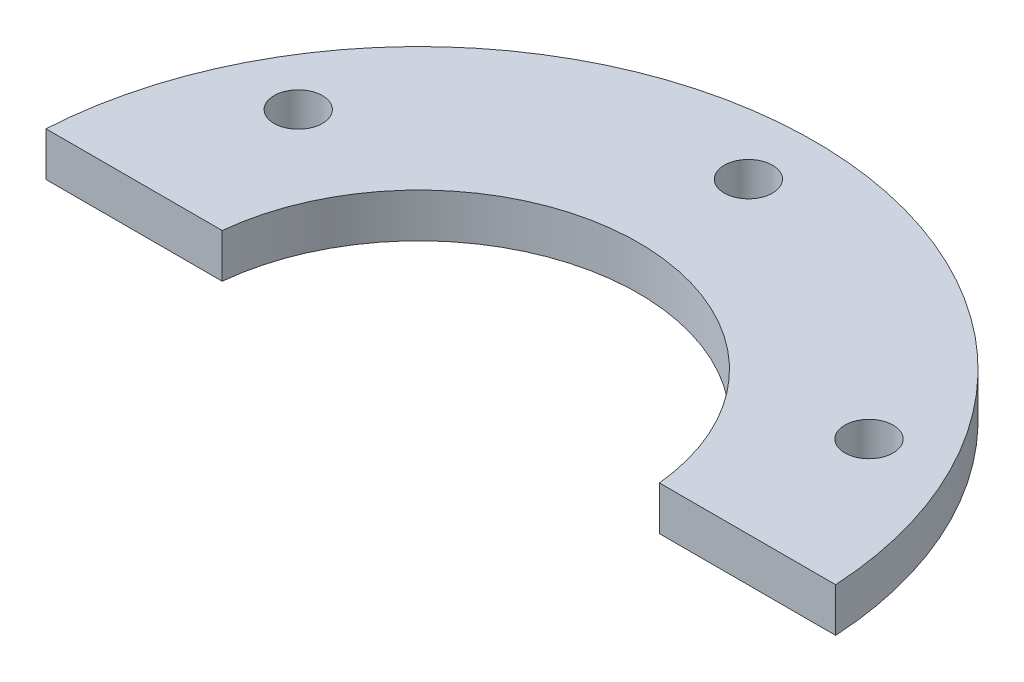
ISO-10303-21;
HEADER;
FILE_DESCRIPTION(('STEP AP214'),'2;1');
FILE_NAME('part.step','',(''),(''),'','','');
FILE_SCHEMA(('AUTOMOTIVE_DESIGN { 1 0 10303 214 1 1 1 1 }'));
ENDSEC;
DATA;
#1=APPLICATION_CONTEXT('core data for automotive mechanical design processes');
#2=APPLICATION_PROTOCOL_DEFINITION('international standard','automotive_design',2000,#1);
#3=PRODUCT_CONTEXT('',#1,'mechanical');
#4=PRODUCT('Part','Part','',(#3));
#5=PRODUCT_RELATED_PRODUCT_CATEGORY('part','',(#4));
#6=PRODUCT_DEFINITION_FORMATION('','',#4);
#7=PRODUCT_DEFINITION_CONTEXT('part definition',#1,'design');
#8=PRODUCT_DEFINITION('design','',#6,#7);
#9=PRODUCT_DEFINITION_SHAPE('','',#8);
#10=(LENGTH_UNIT() NAMED_UNIT(*) SI_UNIT(.MILLI.,.METRE.));
#11=(NAMED_UNIT(*) PLANE_ANGLE_UNIT() SI_UNIT($,.RADIAN.));
#12=(NAMED_UNIT(*) SI_UNIT($,.STERADIAN.) SOLID_ANGLE_UNIT());
#13=UNCERTAINTY_MEASURE_WITH_UNIT(LENGTH_MEASURE(1.E-05),#10,'distance_accuracy_value','');
#14=(GEOMETRIC_REPRESENTATION_CONTEXT(3) GLOBAL_UNCERTAINTY_ASSIGNED_CONTEXT((#13)) GLOBAL_UNIT_ASSIGNED_CONTEXT((#10,
#11,#12)) REPRESENTATION_CONTEXT('',''));
#15=CARTESIAN_POINT('',(0.,0.,0.));
#16=DIRECTION('',(0.,0.,1.));
#17=DIRECTION('',(1.,0.,0.));
#18=AXIS2_PLACEMENT_3D('',#15,#16,#17);
#19=CARTESIAN_POINT('',(0.,10.,0.));
#20=DIRECTION('',(0.,1.,0.));
#21=DIRECTION('',(0.,0.,1.));
#22=AXIS2_PLACEMENT_3D('',#19,#20,#21);
#23=PLANE('',#22);
#24=CARTESIAN_POINT('',(0.,10.,0.));
#25=DIRECTION('',(0.,-1.,0.));
#26=DIRECTION('',(0.,0.,-1.));
#27=AXIS2_PLACEMENT_3D('',#24,#25,#26);
#28=CIRCLE('',#27,90.);
#29=CARTESIAN_POINT('',(-89.8610037780571,10.,-5.));
#30=VERTEX_POINT('',#29);
#31=CARTESIAN_POINT('',(89.8610037780571,10.,-4.99999999999999));
#32=VERTEX_POINT('',#31);
#33=EDGE_CURVE('E55',#30,#32,#28,.T.);
#34=ORIENTED_EDGE('',*,*,#33,.F.);
#35=DIRECTION('',(-1.,0.,0.));
#36=VECTOR('',#35,1.);
#37=CARTESIAN_POINT('',(-89.8610037780571,10.,-5.));
#38=LINE('',#37,#36);
#39=CARTESIAN_POINT('',(-49.749371855331,10.,-4.99999999999999));
#40=VERTEX_POINT('',#39);
#41=EDGE_CURVE('E66',#30,#40,#38,.F.);
#42=ORIENTED_EDGE('',*,*,#41,.T.);
#43=CARTESIAN_POINT('',(0.,10.,0.));
#44=DIRECTION('',(0.,-1.,0.));
#45=DIRECTION('',(0.,0.,-1.));
#46=AXIS2_PLACEMENT_3D('',#43,#44,#45);
#47=CIRCLE('',#46,50.);
#48=CARTESIAN_POINT('',(49.749371855331,10.,-5.));
#49=VERTEX_POINT('',#48);
#50=EDGE_CURVE('E60',#40,#49,#47,.T.);
#51=ORIENTED_EDGE('',*,*,#50,.T.);
#52=DIRECTION('',(-1.,0.,0.));
#53=VECTOR('',#52,1.);
#54=CARTESIAN_POINT('',(49.749371855331,10.,-5.));
#55=LINE('',#54,#53);
#56=EDGE_CURVE('E63',#49,#32,#55,.F.);
#57=ORIENTED_EDGE('',*,*,#56,.T.);
#58=EDGE_LOOP('',(#34,#42,#51,#57));
#59=FACE_BOUND('',#58,.T.);
#60=CARTESIAN_POINT('',(-64.9519052838325,10.,-37.5000000000008));
#61=DIRECTION('',(0.,1.,0.));
#62=DIRECTION('',(0.,0.,1.));
#63=AXIS2_PLACEMENT_3D('',#60,#61,#62);
#64=CIRCLE('',#63,5.49999999999999);
#65=CARTESIAN_POINT('',(-64.9519052838325,10.,-32.0000000000008));
#66=VERTEX_POINT('',#65);
#67=EDGE_CURVE('E80',#66,#66,#64,.F.);
#68=ORIENTED_EDGE('',*,*,#67,.T.);
#69=EDGE_LOOP('',(#68));
#70=FACE_BOUND('',#69,.T.);
#71=CARTESIAN_POINT('',(64.951905283833,10.,-37.4999999999999));
#72=DIRECTION('',(0.,1.,0.));
#73=DIRECTION('',(0.,0.,1.));
#74=AXIS2_PLACEMENT_3D('',#71,#72,#73);
#75=CIRCLE('',#74,5.49999999999999);
#76=CARTESIAN_POINT('',(64.951905283833,10.,-31.9999999999999));
#77=VERTEX_POINT('',#76);
#78=EDGE_CURVE('E70',#77,#77,#75,.F.);
#79=ORIENTED_EDGE('',*,*,#78,.T.);
#80=EDGE_LOOP('',(#79));
#81=FACE_BOUND('',#80,.T.);
#82=CARTESIAN_POINT('',(0.,10.,-75.));
#83=DIRECTION('',(0.,1.,0.));
#84=DIRECTION('',(0.,0.,1.));
#85=AXIS2_PLACEMENT_3D('',#82,#83,#84);
#86=CIRCLE('',#85,5.49999999999999);
#87=CARTESIAN_POINT('',(0.,10.,-69.5));
#88=VERTEX_POINT('',#87);
#89=EDGE_CURVE('E20',#88,#88,#86,.F.);
#90=ORIENTED_EDGE('',*,*,#89,.T.);
#91=EDGE_LOOP('',(#90));
#92=FACE_BOUND('',#91,.T.);
#93=ADVANCED_FACE('F17',(#59,#70,#81,#92),#23,.T.);
#94=CARTESIAN_POINT('',(0.,10.,-75.));
#95=DIRECTION('',(0.,1.,0.));
#96=DIRECTION('',(0.,0.,1.));
#97=AXIS2_PLACEMENT_3D('',#94,#95,#96);
#98=CYLINDRICAL_SURFACE('',#97,5.49999999999999);
#99=ORIENTED_EDGE('',*,*,#89,.F.);
#100=EDGE_LOOP('',(#99));
#101=FACE_BOUND('',#100,.T.);
#102=CARTESIAN_POINT('',(0.,0.,-75.));
#103=DIRECTION('',(0.,1.,0.));
#104=DIRECTION('',(0.,0.,1.));
#105=AXIS2_PLACEMENT_3D('',#102,#103,#104);
#106=CIRCLE('',#105,5.49999999999999);
#107=CARTESIAN_POINT('',(0.,0.,-69.5));
#108=VERTEX_POINT('',#107);
#109=EDGE_CURVE('E95',#108,#108,#106,.F.);
#110=ORIENTED_EDGE('',*,*,#109,.T.);
#111=EDGE_LOOP('',(#110));
#112=FACE_BOUND('',#111,.T.);
#113=ADVANCED_FACE('F137',(#101,#112),#98,.F.);
#114=CARTESIAN_POINT('',(-64.9519052838325,10.,-37.5000000000008));
#115=DIRECTION('',(0.,1.,0.));
#116=DIRECTION('',(0.,0.,1.));
#117=AXIS2_PLACEMENT_3D('',#114,#115,#116);
#118=CYLINDRICAL_SURFACE('',#117,5.49999999999999);
#119=ORIENTED_EDGE('',*,*,#67,.F.);
#120=EDGE_LOOP('',(#119));
#121=FACE_BOUND('',#120,.T.);
#122=CARTESIAN_POINT('',(-64.9519052838325,0.,-37.5000000000008));
#123=DIRECTION('',(0.,1.,0.));
#124=DIRECTION('',(0.,0.,1.));
#125=AXIS2_PLACEMENT_3D('',#122,#123,#124);
#126=CIRCLE('',#125,5.49999999999999);
#127=CARTESIAN_POINT('',(-64.9519052838325,0.,-32.0000000000008));
#128=VERTEX_POINT('',#127);
#129=EDGE_CURVE('E92',#128,#128,#126,.F.);
#130=ORIENTED_EDGE('',*,*,#129,.T.);
#131=EDGE_LOOP('',(#130));
#132=FACE_BOUND('',#131,.T.);
#133=ADVANCED_FACE('F143',(#121,#132),#118,.F.);
#134=CARTESIAN_POINT('',(49.749371855331,10.,-5.));
#135=DIRECTION('',(0.,0.,-1.));
#136=DIRECTION('',(-1.,0.,0.));
#137=AXIS2_PLACEMENT_3D('',#134,#135,#136);
#138=PLANE('',#137);
#139=DIRECTION('',(0.,-1.,0.));
#140=VECTOR('',#139,1.);
#141=CARTESIAN_POINT('',(89.8610037780572,10.,-4.99999999999999));
#142=LINE('',#141,#140);
#143=CARTESIAN_POINT('',(89.8610037780571,0.,-4.99999999999999));
#144=VERTEX_POINT('',#143);
#145=EDGE_CURVE('E77',#32,#144,#142,.T.);
#146=ORIENTED_EDGE('',*,*,#145,.F.);
#147=ORIENTED_EDGE('',*,*,#56,.F.);
#148=DIRECTION('',(0.,1.,0.));
#149=VECTOR('',#148,1.);
#150=CARTESIAN_POINT('',(49.749371855331,10.,-5.));
#151=LINE('',#150,#149);
#152=CARTESIAN_POINT('',(49.749371855331,0.,-5.));
#153=VERTEX_POINT('',#152);
#154=EDGE_CURVE('E76',#153,#49,#151,.T.);
#155=ORIENTED_EDGE('',*,*,#154,.F.);
#156=DIRECTION('',(1.,0.,0.));
#157=VECTOR('',#156,1.);
#158=CARTESIAN_POINT('',(0.,0.,-5.));
#159=LINE('',#158,#157);
#160=EDGE_CURVE('E90',#153,#144,#159,.T.);
#161=ORIENTED_EDGE('',*,*,#160,.T.);
#162=EDGE_LOOP('',(#146,#147,#155,#161));
#163=FACE_BOUND('',#162,.T.);
#164=ADVANCED_FACE('F74',(#163),#138,.F.);
#165=CARTESIAN_POINT('',(0.,10.,0.));
#166=DIRECTION('',(0.,-1.,0.));
#167=DIRECTION('',(0.,0.,-1.));
#168=AXIS2_PLACEMENT_3D('',#165,#166,#167);
#169=CYLINDRICAL_SURFACE('',#168,90.);
#170=CARTESIAN_POINT('',(0.,0.,0.));
#171=DIRECTION('',(0.,-1.,0.));
#172=DIRECTION('',(0.,0.,-1.));
#173=AXIS2_PLACEMENT_3D('',#170,#171,#172);
#174=CIRCLE('',#173,90.);
#175=CARTESIAN_POINT('',(-89.8610037780571,0.,-5.));
#176=VERTEX_POINT('',#175);
#177=EDGE_CURVE('E88',#144,#176,#174,.F.);
#178=ORIENTED_EDGE('',*,*,#177,.T.);
#179=DIRECTION('',(0.,1.,0.));
#180=VECTOR('',#179,1.);
#181=CARTESIAN_POINT('',(-89.8610037780571,10.,-5.));
#182=LINE('',#181,#180);
#183=EDGE_CURVE('E86',#176,#30,#182,.T.);
#184=ORIENTED_EDGE('',*,*,#183,.T.);
#185=ORIENTED_EDGE('',*,*,#33,.T.);
#186=ORIENTED_EDGE('',*,*,#145,.T.);
#187=EDGE_LOOP('',(#178,#184,#185,#186));
#188=FACE_BOUND('',#187,.T.);
#189=ADVANCED_FACE('F101',(#188),#169,.T.);
#190=CARTESIAN_POINT('',(-89.8610037780571,10.,-5.));
#191=DIRECTION('',(0.,0.,-1.));
#192=DIRECTION('',(-1.,0.,0.));
#193=AXIS2_PLACEMENT_3D('',#190,#191,#192);
#194=PLANE('',#193);
#195=DIRECTION('',(0.,-1.,0.));
#196=VECTOR('',#195,1.);
#197=CARTESIAN_POINT('',(-49.749371855331,10.,-4.99999999999999));
#198=LINE('',#197,#196);
#199=CARTESIAN_POINT('',(-49.749371855331,0.,-4.99999999999999));
#200=VERTEX_POINT('',#199);
#201=EDGE_CURVE('E71',#200,#40,#198,.F.);
#202=ORIENTED_EDGE('',*,*,#201,.T.);
#203=ORIENTED_EDGE('',*,*,#41,.F.);
#204=ORIENTED_EDGE('',*,*,#183,.F.);
#205=DIRECTION('',(1.,0.,0.));
#206=VECTOR('',#205,1.);
#207=CARTESIAN_POINT('',(0.,0.,-5.));
#208=LINE('',#207,#206);
#209=EDGE_CURVE('E26',#176,#200,#208,.T.);
#210=ORIENTED_EDGE('',*,*,#209,.T.);
#211=EDGE_LOOP('',(#202,#203,#204,#210));
#212=FACE_BOUND('',#211,.T.);
#213=ADVANCED_FACE('F110',(#212),#194,.F.);
#214=CARTESIAN_POINT('',(0.,10.,0.));
#215=DIRECTION('',(0.,-1.,0.));
#216=DIRECTION('',(0.,0.,-1.));
#217=AXIS2_PLACEMENT_3D('',#214,#215,#216);
#218=CYLINDRICAL_SURFACE('',#217,50.);
#219=ORIENTED_EDGE('',*,*,#50,.F.);
#220=ORIENTED_EDGE('',*,*,#201,.F.);
#221=CARTESIAN_POINT('',(0.,0.,0.));
#222=DIRECTION('',(0.,-1.,0.));
#223=DIRECTION('',(0.,0.,-1.));
#224=AXIS2_PLACEMENT_3D('',#221,#222,#223);
#225=CIRCLE('',#224,50.);
#226=EDGE_CURVE('E35',#200,#153,#225,.T.);
#227=ORIENTED_EDGE('',*,*,#226,.T.);
#228=ORIENTED_EDGE('',*,*,#154,.T.);
#229=EDGE_LOOP('',(#219,#220,#227,#228));
#230=FACE_BOUND('',#229,.T.);
#231=ADVANCED_FACE('F79',(#230),#218,.F.);
#232=CARTESIAN_POINT('',(64.951905283833,10.,-37.4999999999999));
#233=DIRECTION('',(0.,1.,0.));
#234=DIRECTION('',(0.,0.,1.));
#235=AXIS2_PLACEMENT_3D('',#232,#233,#234);
#236=CYLINDRICAL_SURFACE('',#235,5.49999999999999);
#237=ORIENTED_EDGE('',*,*,#78,.F.);
#238=EDGE_LOOP('',(#237));
#239=FACE_BOUND('',#238,.T.);
#240=CARTESIAN_POINT('',(64.951905283833,0.,-37.4999999999999));
#241=DIRECTION('',(0.,1.,0.));
#242=DIRECTION('',(0.,0.,1.));
#243=AXIS2_PLACEMENT_3D('',#240,#241,#242);
#244=CIRCLE('',#243,5.49999999999999);
#245=CARTESIAN_POINT('',(64.951905283833,0.,-31.9999999999999));
#246=VERTEX_POINT('',#245);
#247=EDGE_CURVE('E11',#246,#246,#244,.F.);
#248=ORIENTED_EDGE('',*,*,#247,.T.);
#249=EDGE_LOOP('',(#248));
#250=FACE_BOUND('',#249,.T.);
#251=ADVANCED_FACE('F118',(#239,#250),#236,.F.);
#252=CARTESIAN_POINT('',(0.,0.,0.));
#253=DIRECTION('',(0.,1.,0.));
#254=DIRECTION('',(0.,0.,1.));
#255=AXIS2_PLACEMENT_3D('',#252,#253,#254);
#256=PLANE('',#255);
#257=ORIENTED_EDGE('',*,*,#247,.F.);
#258=EDGE_LOOP('',(#257));
#259=FACE_BOUND('',#258,.T.);
#260=ORIENTED_EDGE('',*,*,#209,.F.);
#261=ORIENTED_EDGE('',*,*,#177,.F.);
#262=ORIENTED_EDGE('',*,*,#160,.F.);
#263=ORIENTED_EDGE('',*,*,#226,.F.);
#264=EDGE_LOOP('',(#260,#261,#262,#263));
#265=FACE_BOUND('',#264,.T.);
#266=ORIENTED_EDGE('',*,*,#129,.F.);
#267=EDGE_LOOP('',(#266));
#268=FACE_BOUND('',#267,.T.);
#269=ORIENTED_EDGE('',*,*,#109,.F.);
#270=EDGE_LOOP('',(#269));
#271=FACE_BOUND('',#270,.T.);
#272=ADVANCED_FACE('F103',(#259,#265,#268,#271),#256,.F.);
#273=CLOSED_SHELL('',(#93,#113,#133,#164,#189,#213,#231,#251,#272));
#274=MANIFOLD_SOLID_BREP('B1',#273);
#275=ADVANCED_BREP_SHAPE_REPRESENTATION('',(#18,#274),#14);
#276=SHAPE_DEFINITION_REPRESENTATION(#9,#275);
ENDSEC;
END-ISO-10303-21;
